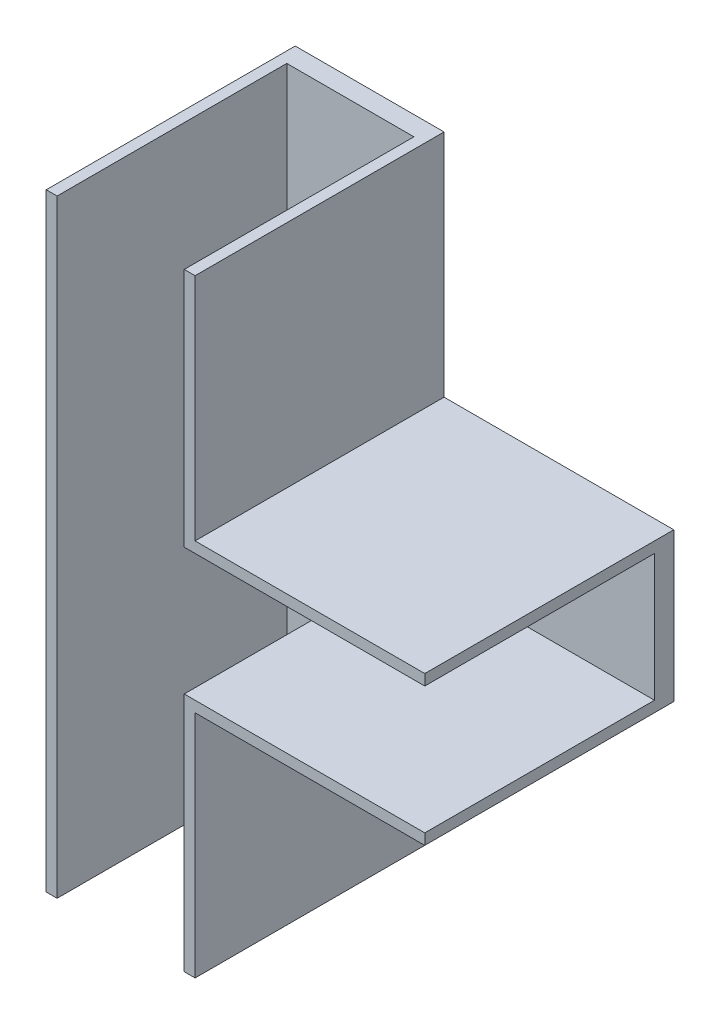
ISO-10303-21;
HEADER;
FILE_DESCRIPTION(('STEP AP214'),'2;1');
FILE_NAME('part.step','',(''),(''),'','','');
FILE_SCHEMA(('AUTOMOTIVE_DESIGN { 1 0 10303 214 1 1 1 1 }'));
ENDSEC;
DATA;
#1=APPLICATION_CONTEXT('core data for automotive mechanical design processes');
#2=APPLICATION_PROTOCOL_DEFINITION('international standard','automotive_design',2000,#1);
#3=PRODUCT_CONTEXT('',#1,'mechanical');
#4=PRODUCT('Part','Part','',(#3));
#5=PRODUCT_RELATED_PRODUCT_CATEGORY('part','',(#4));
#6=PRODUCT_DEFINITION_FORMATION('','',#4);
#7=PRODUCT_DEFINITION_CONTEXT('part definition',#1,'design');
#8=PRODUCT_DEFINITION('design','',#6,#7);
#9=PRODUCT_DEFINITION_SHAPE('','',#8);
#10=(LENGTH_UNIT() NAMED_UNIT(*) SI_UNIT(.MILLI.,.METRE.));
#11=(NAMED_UNIT(*) PLANE_ANGLE_UNIT() SI_UNIT($,.RADIAN.));
#12=(NAMED_UNIT(*) SI_UNIT($,.STERADIAN.) SOLID_ANGLE_UNIT());
#13=UNCERTAINTY_MEASURE_WITH_UNIT(LENGTH_MEASURE(1.E-05),#10,'distance_accuracy_value','');
#14=(GEOMETRIC_REPRESENTATION_CONTEXT(3) GLOBAL_UNCERTAINTY_ASSIGNED_CONTEXT((#13)) GLOBAL_UNIT_ASSIGNED_CONTEXT((#10,
#11,#12)) REPRESENTATION_CONTEXT('',''));
#15=CARTESIAN_POINT('',(0.,0.,0.));
#16=DIRECTION('',(0.,0.,1.));
#17=DIRECTION('',(1.,0.,0.));
#18=AXIS2_PLACEMENT_3D('',#15,#16,#17);
#19=CARTESIAN_POINT('',(0.,0.,0.8));
#20=DIRECTION('',(0.,0.,-1.));
#21=DIRECTION('',(-1.,0.,0.));
#22=AXIS2_PLACEMENT_3D('',#19,#20,#21);
#23=PLANE('',#22);
#24=DIRECTION('',(0.,-1.,0.));
#25=VECTOR('',#24,1.);
#26=CARTESIAN_POINT('',(5.7222,15.2472,0.8));
#27=LINE('',#26,#25);
#28=CARTESIAN_POINT('',(5.7222,25.2222,0.8));
#29=VERTEX_POINT('',#28);
#30=CARTESIAN_POINT('',(5.7222,15.2472,0.8));
#31=VERTEX_POINT('',#30);
#32=EDGE_CURVE('E173',#29,#31,#27,.T.);
#33=ORIENTED_EDGE('',*,*,#32,.F.);
#34=DIRECTION('',(-1.,0.,0.));
#35=VECTOR('',#34,1.);
#36=CARTESIAN_POINT('',(0.,25.2222,0.8));
#37=LINE('',#36,#35);
#38=CARTESIAN_POINT('',(0.45,25.2222,0.8));
#39=VERTEX_POINT('',#38);
#40=EDGE_CURVE('E246',#29,#39,#37,.T.);
#41=ORIENTED_EDGE('',*,*,#40,.T.);
#42=DIRECTION('',(0.,1.,0.));
#43=VECTOR('',#42,1.);
#44=CARTESIAN_POINT('',(0.45,25.2222,0.8));
#45=LINE('',#44,#43);
#46=CARTESIAN_POINT('',(0.450000000000002,0.,0.8));
#47=VERTEX_POINT('',#46);
#48=EDGE_CURVE('E221',#47,#39,#45,.T.);
#49=ORIENTED_EDGE('',*,*,#48,.F.);
#50=DIRECTION('',(1.,0.,0.));
#51=VECTOR('',#50,1.);
#52=CARTESIAN_POINT('',(6.1722,0.,0.8));
#53=LINE('',#52,#51);
#54=CARTESIAN_POINT('',(5.7222,0.,0.8));
#55=VERTEX_POINT('',#54);
#56=EDGE_CURVE('E242',#47,#55,#53,.T.);
#57=ORIENTED_EDGE('',*,*,#56,.T.);
#58=DIRECTION('',(0.,-1.,0.));
#59=VECTOR('',#58,1.);
#60=CARTESIAN_POINT('',(5.7222,0.,0.8));
#61=LINE('',#60,#59);
#62=CARTESIAN_POINT('',(5.7222,9.975,0.8));
#63=VERTEX_POINT('',#62);
#64=EDGE_CURVE('E196',#63,#55,#61,.T.);
#65=ORIENTED_EDGE('',*,*,#64,.F.);
#66=DIRECTION('',(-1.,0.,0.));
#67=VECTOR('',#66,1.);
#68=CARTESIAN_POINT('',(5.7222,9.975,0.8));
#69=LINE('',#68,#67);
#70=CARTESIAN_POINT('',(15.6972,9.975,0.8));
#71=VERTEX_POINT('',#70);
#72=EDGE_CURVE('E191',#71,#63,#69,.T.);
#73=ORIENTED_EDGE('',*,*,#72,.F.);
#74=DIRECTION('',(0.,1.,0.));
#75=VECTOR('',#74,1.);
#76=CARTESIAN_POINT('',(15.6972,15.6972,0.8));
#77=LINE('',#76,#75);
#78=CARTESIAN_POINT('',(15.6972,15.2472,0.8));
#79=VERTEX_POINT('',#78);
#80=EDGE_CURVE('E53',#71,#79,#77,.T.);
#81=ORIENTED_EDGE('',*,*,#80,.T.);
#82=DIRECTION('',(1.,0.,0.));
#83=VECTOR('',#82,1.);
#84=CARTESIAN_POINT('',(15.6972,15.2472,0.8));
#85=LINE('',#84,#83);
#86=EDGE_CURVE('E48',#31,#79,#85,.T.);
#87=ORIENTED_EDGE('',*,*,#86,.F.);
#88=EDGE_LOOP('',(#33,#41,#49,#57,#65,#73,#81,#87));
#89=FACE_BOUND('',#88,.T.);
#90=ADVANCED_FACE('F33',(#89),#23,.F.);
#91=CARTESIAN_POINT('',(6.1722,0.,0.8));
#92=DIRECTION('',(0.,1.,0.));
#93=DIRECTION('',(-1.,0.,0.));
#94=AXIS2_PLACEMENT_3D('',#91,#92,#93);
#95=PLANE('',#94);
#96=DIRECTION('',(1.,0.,0.));
#97=VECTOR('',#96,1.);
#98=CARTESIAN_POINT('',(6.1722,0.,0.));
#99=LINE('',#98,#97);
#100=CARTESIAN_POINT('',(0.,0.,0.));
#101=VERTEX_POINT('',#100);
#102=CARTESIAN_POINT('',(6.1722,0.,0.));
#103=VERTEX_POINT('',#102);
#104=EDGE_CURVE('E241',#101,#103,#99,.T.);
#105=ORIENTED_EDGE('',*,*,#104,.T.);
#106=DIRECTION('',(0.,0.,-1.));
#107=VECTOR('',#106,1.);
#108=CARTESIAN_POINT('',(6.1722,0.,0.8));
#109=LINE('',#108,#107);
#110=CARTESIAN_POINT('',(6.1722,0.,10.325));
#111=VERTEX_POINT('',#110);
#112=EDGE_CURVE('E11',#111,#103,#109,.T.);
#113=ORIENTED_EDGE('',*,*,#112,.F.);
#114=DIRECTION('',(1.,0.,0.));
#115=VECTOR('',#114,1.);
#116=CARTESIAN_POINT('',(5.7222,0.,10.325));
#117=LINE('',#116,#115);
#118=CARTESIAN_POINT('',(5.7222,0.,10.325));
#119=VERTEX_POINT('',#118);
#120=EDGE_CURVE('E192',#119,#111,#117,.T.);
#121=ORIENTED_EDGE('',*,*,#120,.F.);
#122=DIRECTION('',(0.,0.,-1.));
#123=VECTOR('',#122,1.);
#124=CARTESIAN_POINT('',(5.7222,0.,10.325));
#125=LINE('',#124,#123);
#126=EDGE_CURVE('E208',#119,#55,#125,.T.);
#127=ORIENTED_EDGE('',*,*,#126,.T.);
#128=ORIENTED_EDGE('',*,*,#56,.F.);
#129=DIRECTION('',(0.,0.,-1.));
#130=VECTOR('',#129,1.);
#131=CARTESIAN_POINT('',(0.450000000000003,0.,10.325));
#132=LINE('',#131,#130);
#133=CARTESIAN_POINT('',(0.450000000000003,0.,10.325));
#134=VERTEX_POINT('',#133);
#135=EDGE_CURVE('E238',#134,#47,#132,.T.);
#136=ORIENTED_EDGE('',*,*,#135,.F.);
#137=DIRECTION('',(1.,0.,0.));
#138=VECTOR('',#137,1.);
#139=CARTESIAN_POINT('',(0.,0.,10.325));
#140=LINE('',#139,#138);
#141=CARTESIAN_POINT('',(0.,0.,10.325));
#142=VERTEX_POINT('',#141);
#143=EDGE_CURVE('E222',#142,#134,#140,.T.);
#144=ORIENTED_EDGE('',*,*,#143,.F.);
#145=DIRECTION('',(0.,0.,-1.));
#146=VECTOR('',#145,1.);
#147=CARTESIAN_POINT('',(0.,0.,0.8));
#148=LINE('',#147,#146);
#149=EDGE_CURVE('E248',#142,#101,#148,.T.);
#150=ORIENTED_EDGE('',*,*,#149,.T.);
#151=EDGE_LOOP('',(#105,#113,#121,#127,#128,#136,#144,#150));
#152=FACE_BOUND('',#151,.T.);
#153=ADVANCED_FACE('F35',(#152),#95,.F.);
#154=CARTESIAN_POINT('',(6.1722,9.525,0.8));
#155=DIRECTION('',(-1.,0.,0.));
#156=DIRECTION('',(0.,-1.,0.));
#157=AXIS2_PLACEMENT_3D('',#154,#155,#156);
#158=PLANE('',#157);
#159=DIRECTION('',(0.,1.,0.));
#160=VECTOR('',#159,1.);
#161=CARTESIAN_POINT('',(6.1722,9.525,0.));
#162=LINE('',#161,#160);
#163=CARTESIAN_POINT('',(6.1722,9.525,0.));
#164=VERTEX_POINT('',#163);
#165=EDGE_CURVE('E251',#103,#164,#162,.T.);
#166=ORIENTED_EDGE('',*,*,#165,.T.);
#167=DIRECTION('',(0.,0.,-1.));
#168=VECTOR('',#167,1.);
#169=CARTESIAN_POINT('',(6.1722,9.525,0.8));
#170=LINE('',#169,#168);
#171=CARTESIAN_POINT('',(6.1722,9.525,10.325));
#172=VERTEX_POINT('',#171);
#173=EDGE_CURVE('E41',#172,#164,#170,.T.);
#174=ORIENTED_EDGE('',*,*,#173,.F.);
#175=DIRECTION('',(0.,1.,0.));
#176=VECTOR('',#175,1.);
#177=CARTESIAN_POINT('',(6.1722,0.,10.325));
#178=LINE('',#177,#176);
#179=EDGE_CURVE('E195',#111,#172,#178,.T.);
#180=ORIENTED_EDGE('',*,*,#179,.F.);
#181=ORIENTED_EDGE('',*,*,#112,.T.);
#182=EDGE_LOOP('',(#166,#174,#180,#181));
#183=FACE_BOUND('',#182,.T.);
#184=ADVANCED_FACE('F307',(#183),#158,.F.);
#185=CARTESIAN_POINT('',(15.6972,9.525,0.8));
#186=DIRECTION('',(0.,1.,0.));
#187=DIRECTION('',(-1.,0.,0.));
#188=AXIS2_PLACEMENT_3D('',#185,#186,#187);
#189=PLANE('',#188);
#190=DIRECTION('',(1.,0.,0.));
#191=VECTOR('',#190,1.);
#192=CARTESIAN_POINT('',(15.6972,9.525,0.));
#193=LINE('',#192,#191);
#194=CARTESIAN_POINT('',(15.6972,9.525,0.));
#195=VERTEX_POINT('',#194);
#196=EDGE_CURVE('E253',#164,#195,#193,.T.);
#197=ORIENTED_EDGE('',*,*,#196,.T.);
#198=DIRECTION('',(0.,0.,-1.));
#199=VECTOR('',#198,1.);
#200=CARTESIAN_POINT('',(15.6972,9.525,0.8));
#201=LINE('',#200,#199);
#202=CARTESIAN_POINT('',(15.6972,9.525,10.325));
#203=VERTEX_POINT('',#202);
#204=EDGE_CURVE('E156',#203,#195,#201,.T.);
#205=ORIENTED_EDGE('',*,*,#204,.F.);
#206=DIRECTION('',(1.,0.,0.));
#207=VECTOR('',#206,1.);
#208=CARTESIAN_POINT('',(6.1722,9.525,10.325));
#209=LINE('',#208,#207);
#210=EDGE_CURVE('E199',#172,#203,#209,.T.);
#211=ORIENTED_EDGE('',*,*,#210,.F.);
#212=ORIENTED_EDGE('',*,*,#173,.T.);
#213=EDGE_LOOP('',(#197,#205,#211,#212));
#214=FACE_BOUND('',#213,.T.);
#215=ADVANCED_FACE('F276',(#214),#189,.F.);
#216=CARTESIAN_POINT('',(15.6972,15.6972,0.8));
#217=DIRECTION('',(-1.,0.,0.));
#218=DIRECTION('',(0.,0.,1.));
#219=AXIS2_PLACEMENT_3D('',#216,#217,#218);
#220=PLANE('',#219);
#221=DIRECTION('',(0.,1.,0.));
#222=VECTOR('',#221,1.);
#223=CARTESIAN_POINT('',(15.6972,15.6972,0.));
#224=LINE('',#223,#222);
#225=CARTESIAN_POINT('',(15.6972,15.6972,0.));
#226=VERTEX_POINT('',#225);
#227=EDGE_CURVE('E153',#195,#226,#224,.T.);
#228=ORIENTED_EDGE('',*,*,#227,.T.);
#229=DIRECTION('',(0.,0.,-1.));
#230=VECTOR('',#229,1.);
#231=CARTESIAN_POINT('',(15.6972,15.6972,0.8));
#232=LINE('',#231,#230);
#233=CARTESIAN_POINT('',(15.6972,15.6972,10.325));
#234=VERTEX_POINT('',#233);
#235=EDGE_CURVE('E145',#234,#226,#232,.T.);
#236=ORIENTED_EDGE('',*,*,#235,.F.);
#237=DIRECTION('',(0.,1.,0.));
#238=VECTOR('',#237,1.);
#239=CARTESIAN_POINT('',(15.6972,15.6972,10.325));
#240=LINE('',#239,#238);
#241=CARTESIAN_POINT('',(15.6972,15.2472,10.325));
#242=VERTEX_POINT('',#241);
#243=EDGE_CURVE('E150',#242,#234,#240,.T.);
#244=ORIENTED_EDGE('',*,*,#243,.F.);
#245=DIRECTION('',(0.,0.,-1.));
#246=VECTOR('',#245,1.);
#247=CARTESIAN_POINT('',(15.6972,15.2472,10.325));
#248=LINE('',#247,#246);
#249=EDGE_CURVE('E182',#242,#79,#248,.T.);
#250=ORIENTED_EDGE('',*,*,#249,.T.);
#251=ORIENTED_EDGE('',*,*,#80,.F.);
#252=DIRECTION('',(0.,0.,-1.));
#253=VECTOR('',#252,1.);
#254=CARTESIAN_POINT('',(15.6972,9.975,10.325));
#255=LINE('',#254,#253);
#256=CARTESIAN_POINT('',(15.6972,9.975,10.325));
#257=VERTEX_POINT('',#256);
#258=EDGE_CURVE('E218',#257,#71,#255,.T.);
#259=ORIENTED_EDGE('',*,*,#258,.F.);
#260=DIRECTION('',(0.,1.,0.));
#261=VECTOR('',#260,1.);
#262=CARTESIAN_POINT('',(15.6972,9.975,10.325));
#263=LINE('',#262,#261);
#264=EDGE_CURVE('E202',#203,#257,#263,.T.);
#265=ORIENTED_EDGE('',*,*,#264,.F.);
#266=ORIENTED_EDGE('',*,*,#204,.T.);
#267=EDGE_LOOP('',(#228,#236,#244,#250,#251,#259,#265,#266));
#268=FACE_BOUND('',#267,.T.);
#269=ADVANCED_FACE('F147',(#268),#220,.F.);
#270=CARTESIAN_POINT('',(6.1722,15.6972,0.8));
#271=DIRECTION('',(0.,-1.,0.));
#272=DIRECTION('',(0.,0.,-1.));
#273=AXIS2_PLACEMENT_3D('',#270,#271,#272);
#274=PLANE('',#273);
#275=DIRECTION('',(-1.,0.,0.));
#276=VECTOR('',#275,1.);
#277=CARTESIAN_POINT('',(6.1722,15.6972,0.));
#278=LINE('',#277,#276);
#279=CARTESIAN_POINT('',(6.1722,15.6972,0.));
#280=VERTEX_POINT('',#279);
#281=EDGE_CURVE('E256',#226,#280,#278,.T.);
#282=ORIENTED_EDGE('',*,*,#281,.T.);
#283=DIRECTION('',(0.,0.,-1.));
#284=VECTOR('',#283,1.);
#285=CARTESIAN_POINT('',(6.1722,15.6972,0.8));
#286=LINE('',#285,#284);
#287=CARTESIAN_POINT('',(6.1722,15.6972,10.325));
#288=VERTEX_POINT('',#287);
#289=EDGE_CURVE('E157',#288,#280,#286,.T.);
#290=ORIENTED_EDGE('',*,*,#289,.F.);
#291=DIRECTION('',(-1.,0.,0.));
#292=VECTOR('',#291,1.);
#293=CARTESIAN_POINT('',(15.6972,15.6972,10.325));
#294=LINE('',#293,#292);
#295=EDGE_CURVE('E160',#234,#288,#294,.T.);
#296=ORIENTED_EDGE('',*,*,#295,.F.);
#297=ORIENTED_EDGE('',*,*,#235,.T.);
#298=EDGE_LOOP('',(#282,#290,#296,#297));
#299=FACE_BOUND('',#298,.T.);
#300=ADVANCED_FACE('F161',(#299),#274,.F.);
#301=CARTESIAN_POINT('',(6.1722,25.2222,0.8));
#302=DIRECTION('',(-1.,0.,0.));
#303=DIRECTION('',(0.,0.,1.));
#304=AXIS2_PLACEMENT_3D('',#301,#302,#303);
#305=PLANE('',#304);
#306=DIRECTION('',(0.,1.,0.));
#307=VECTOR('',#306,1.);
#308=CARTESIAN_POINT('',(6.1722,25.2222,0.));
#309=LINE('',#308,#307);
#310=CARTESIAN_POINT('',(6.1722,25.2222,0.));
#311=VERTEX_POINT('',#310);
#312=EDGE_CURVE('E258',#280,#311,#309,.T.);
#313=ORIENTED_EDGE('',*,*,#312,.T.);
#314=DIRECTION('',(0.,0.,-1.));
#315=VECTOR('',#314,1.);
#316=CARTESIAN_POINT('',(6.1722,25.2222,0.8));
#317=LINE('',#316,#315);
#318=CARTESIAN_POINT('',(6.1722,25.2222,10.325));
#319=VERTEX_POINT('',#318);
#320=EDGE_CURVE('E268',#319,#311,#317,.T.);
#321=ORIENTED_EDGE('',*,*,#320,.F.);
#322=DIRECTION('',(0.,1.,0.));
#323=VECTOR('',#322,1.);
#324=CARTESIAN_POINT('',(6.1722,15.6972,10.325));
#325=LINE('',#324,#323);
#326=EDGE_CURVE('E166',#288,#319,#325,.T.);
#327=ORIENTED_EDGE('',*,*,#326,.F.);
#328=ORIENTED_EDGE('',*,*,#289,.T.);
#329=EDGE_LOOP('',(#313,#321,#327,#328));
#330=FACE_BOUND('',#329,.T.);
#331=ADVANCED_FACE('F285',(#330),#305,.F.);
#332=CARTESIAN_POINT('',(0.,25.2222,0.8));
#333=DIRECTION('',(0.,-1.,0.));
#334=DIRECTION('',(0.,0.,-1.));
#335=AXIS2_PLACEMENT_3D('',#332,#333,#334);
#336=PLANE('',#335);
#337=DIRECTION('',(-1.,0.,0.));
#338=VECTOR('',#337,1.);
#339=CARTESIAN_POINT('',(0.,25.2222,0.));
#340=LINE('',#339,#338);
#341=CARTESIAN_POINT('',(0.,25.2222,0.));
#342=VERTEX_POINT('',#341);
#343=EDGE_CURVE('E260',#311,#342,#340,.T.);
#344=ORIENTED_EDGE('',*,*,#343,.T.);
#345=DIRECTION('',(0.,0.,-1.));
#346=VECTOR('',#345,1.);
#347=CARTESIAN_POINT('',(0.,25.2222,0.8));
#348=LINE('',#347,#346);
#349=CARTESIAN_POINT('',(0.,25.2222,10.325));
#350=VERTEX_POINT('',#349);
#351=EDGE_CURVE('E265',#350,#342,#348,.T.);
#352=ORIENTED_EDGE('',*,*,#351,.F.);
#353=DIRECTION('',(-1.,0.,0.));
#354=VECTOR('',#353,1.);
#355=CARTESIAN_POINT('',(0.,25.2222,10.325));
#356=LINE('',#355,#354);
#357=CARTESIAN_POINT('',(0.45,25.2222,10.325));
#358=VERTEX_POINT('',#357);
#359=EDGE_CURVE('E227',#358,#350,#356,.T.);
#360=ORIENTED_EDGE('',*,*,#359,.F.);
#361=DIRECTION('',(0.,0.,-1.));
#362=VECTOR('',#361,1.);
#363=CARTESIAN_POINT('',(0.45,25.2222,10.325));
#364=LINE('',#363,#362);
#365=EDGE_CURVE('E233',#358,#39,#364,.T.);
#366=ORIENTED_EDGE('',*,*,#365,.T.);
#367=ORIENTED_EDGE('',*,*,#40,.F.);
#368=DIRECTION('',(0.,0.,-1.));
#369=VECTOR('',#368,1.);
#370=CARTESIAN_POINT('',(5.7222,25.2222,10.325));
#371=LINE('',#370,#369);
#372=CARTESIAN_POINT('',(5.7222,25.2222,10.325));
#373=VERTEX_POINT('',#372);
#374=EDGE_CURVE('E188',#373,#29,#371,.T.);
#375=ORIENTED_EDGE('',*,*,#374,.F.);
#376=DIRECTION('',(-1.,0.,0.));
#377=VECTOR('',#376,1.);
#378=CARTESIAN_POINT('',(6.1722,25.2222,10.325));
#379=LINE('',#378,#377);
#380=EDGE_CURVE('E177',#319,#373,#379,.T.);
#381=ORIENTED_EDGE('',*,*,#380,.F.);
#382=ORIENTED_EDGE('',*,*,#320,.T.);
#383=EDGE_LOOP('',(#344,#352,#360,#366,#367,#375,#381,#382));
#384=FACE_BOUND('',#383,.T.);
#385=ADVANCED_FACE('F289',(#384),#336,.F.);
#386=CARTESIAN_POINT('',(0.,0.,0.8));
#387=DIRECTION('',(1.,0.,0.));
#388=DIRECTION('',(0.,0.,-1.));
#389=AXIS2_PLACEMENT_3D('',#386,#387,#388);
#390=PLANE('',#389);
#391=DIRECTION('',(0.,-1.,0.));
#392=VECTOR('',#391,1.);
#393=CARTESIAN_POINT('',(0.,0.,0.));
#394=LINE('',#393,#392);
#395=EDGE_CURVE('E244',#342,#101,#394,.T.);
#396=ORIENTED_EDGE('',*,*,#395,.T.);
#397=ORIENTED_EDGE('',*,*,#149,.F.);
#398=DIRECTION('',(0.,-1.,0.));
#399=VECTOR('',#398,1.);
#400=CARTESIAN_POINT('',(0.,25.2222,10.325));
#401=LINE('',#400,#399);
#402=EDGE_CURVE('E230',#350,#142,#401,.T.);
#403=ORIENTED_EDGE('',*,*,#402,.F.);
#404=ORIENTED_EDGE('',*,*,#351,.T.);
#405=EDGE_LOOP('',(#396,#397,#403,#404));
#406=FACE_BOUND('',#405,.T.);
#407=ADVANCED_FACE('F312',(#406),#390,.F.);
#408=CARTESIAN_POINT('',(0.,0.,0.));
#409=DIRECTION('',(0.,0.,-1.));
#410=DIRECTION('',(-1.,0.,0.));
#411=AXIS2_PLACEMENT_3D('',#408,#409,#410);
#412=PLANE('',#411);
#413=ORIENTED_EDGE('',*,*,#104,.F.);
#414=ORIENTED_EDGE('',*,*,#395,.F.);
#415=ORIENTED_EDGE('',*,*,#343,.F.);
#416=ORIENTED_EDGE('',*,*,#312,.F.);
#417=ORIENTED_EDGE('',*,*,#281,.F.);
#418=ORIENTED_EDGE('',*,*,#227,.F.);
#419=ORIENTED_EDGE('',*,*,#196,.F.);
#420=ORIENTED_EDGE('',*,*,#165,.F.);
#421=EDGE_LOOP('',(#413,#414,#415,#416,#417,#418,#419,#420));
#422=FACE_BOUND('',#421,.T.);
#423=ADVANCED_FACE('F281',(#422),#412,.T.);
#424=CARTESIAN_POINT('',(0.45,25.2222,10.325));
#425=DIRECTION('',(-1.,0.,0.));
#426=DIRECTION('',(0.,-1.,0.));
#427=AXIS2_PLACEMENT_3D('',#424,#425,#426);
#428=PLANE('',#427);
#429=ORIENTED_EDGE('',*,*,#48,.T.);
#430=ORIENTED_EDGE('',*,*,#365,.F.);
#431=DIRECTION('',(0.,1.,0.));
#432=VECTOR('',#431,1.);
#433=CARTESIAN_POINT('',(0.45,25.2222,10.325));
#434=LINE('',#433,#432);
#435=EDGE_CURVE('E225',#134,#358,#434,.T.);
#436=ORIENTED_EDGE('',*,*,#435,.F.);
#437=ORIENTED_EDGE('',*,*,#135,.T.);
#438=EDGE_LOOP('',(#429,#430,#436,#437));
#439=FACE_BOUND('',#438,.T.);
#440=ADVANCED_FACE('F320',(#439),#428,.F.);
#441=CARTESIAN_POINT('',(0.,0.,10.325));
#442=DIRECTION('',(0.,0.,-1.));
#443=DIRECTION('',(-1.,0.,0.));
#444=AXIS2_PLACEMENT_3D('',#441,#442,#443);
#445=PLANE('',#444);
#446=ORIENTED_EDGE('',*,*,#143,.T.);
#447=ORIENTED_EDGE('',*,*,#435,.T.);
#448=ORIENTED_EDGE('',*,*,#359,.T.);
#449=ORIENTED_EDGE('',*,*,#402,.T.);
#450=EDGE_LOOP('',(#446,#447,#448,#449));
#451=FACE_BOUND('',#450,.T.);
#452=ADVANCED_FACE('F316',(#451),#445,.F.);
#453=CARTESIAN_POINT('',(5.7222,9.975,10.325));
#454=DIRECTION('',(0.,-1.,0.));
#455=DIRECTION('',(0.,0.,-1.));
#456=AXIS2_PLACEMENT_3D('',#453,#454,#455);
#457=PLANE('',#456);
#458=ORIENTED_EDGE('',*,*,#72,.T.);
#459=DIRECTION('',(0.,0.,-1.));
#460=VECTOR('',#459,1.);
#461=CARTESIAN_POINT('',(5.7222,9.975,10.325));
#462=LINE('',#461,#460);
#463=CARTESIAN_POINT('',(5.7222,9.975,10.325));
#464=VERTEX_POINT('',#463);
#465=EDGE_CURVE('E215',#464,#63,#462,.T.);
#466=ORIENTED_EDGE('',*,*,#465,.F.);
#467=DIRECTION('',(-1.,0.,0.));
#468=VECTOR('',#467,1.);
#469=CARTESIAN_POINT('',(5.7222,9.975,10.325));
#470=LINE('',#469,#468);
#471=EDGE_CURVE('E204',#257,#464,#470,.T.);
#472=ORIENTED_EDGE('',*,*,#471,.F.);
#473=ORIENTED_EDGE('',*,*,#258,.T.);
#474=EDGE_LOOP('',(#458,#466,#472,#473));
#475=FACE_BOUND('',#474,.T.);
#476=ADVANCED_FACE('F301',(#475),#457,.F.);
#477=CARTESIAN_POINT('',(5.7222,0.,10.325));
#478=DIRECTION('',(1.,0.,0.));
#479=DIRECTION('',(0.,0.,-1.));
#480=AXIS2_PLACEMENT_3D('',#477,#478,#479);
#481=PLANE('',#480);
#482=ORIENTED_EDGE('',*,*,#64,.T.);
#483=ORIENTED_EDGE('',*,*,#126,.F.);
#484=DIRECTION('',(0.,-1.,0.));
#485=VECTOR('',#484,1.);
#486=CARTESIAN_POINT('',(5.7222,0.,10.325));
#487=LINE('',#486,#485);
#488=EDGE_CURVE('E206',#464,#119,#487,.T.);
#489=ORIENTED_EDGE('',*,*,#488,.F.);
#490=ORIENTED_EDGE('',*,*,#465,.T.);
#491=EDGE_LOOP('',(#482,#483,#489,#490));
#492=FACE_BOUND('',#491,.T.);
#493=ADVANCED_FACE('F323',(#492),#481,.F.);
#494=CARTESIAN_POINT('',(0.,0.,10.325));
#495=DIRECTION('',(0.,0.,1.));
#496=DIRECTION('',(1.,0.,0.));
#497=AXIS2_PLACEMENT_3D('',#494,#495,#496);
#498=PLANE('',#497);
#499=ORIENTED_EDGE('',*,*,#120,.T.);
#500=ORIENTED_EDGE('',*,*,#179,.T.);
#501=ORIENTED_EDGE('',*,*,#210,.T.);
#502=ORIENTED_EDGE('',*,*,#264,.T.);
#503=ORIENTED_EDGE('',*,*,#471,.T.);
#504=ORIENTED_EDGE('',*,*,#488,.T.);
#505=EDGE_LOOP('',(#499,#500,#501,#502,#503,#504));
#506=FACE_BOUND('',#505,.T.);
#507=ADVANCED_FACE('F304',(#506),#498,.T.);
#508=CARTESIAN_POINT('',(5.7222,15.2472,10.325));
#509=DIRECTION('',(1.,0.,0.));
#510=DIRECTION('',(0.,0.,-1.));
#511=AXIS2_PLACEMENT_3D('',#508,#509,#510);
#512=PLANE('',#511);
#513=ORIENTED_EDGE('',*,*,#32,.T.);
#514=DIRECTION('',(0.,0.,-1.));
#515=VECTOR('',#514,1.);
#516=CARTESIAN_POINT('',(5.7222,15.2472,10.325));
#517=LINE('',#516,#515);
#518=CARTESIAN_POINT('',(5.7222,15.2472,10.325));
#519=VERTEX_POINT('',#518);
#520=EDGE_CURVE('E185',#519,#31,#517,.T.);
#521=ORIENTED_EDGE('',*,*,#520,.F.);
#522=DIRECTION('',(0.,-1.,0.));
#523=VECTOR('',#522,1.);
#524=CARTESIAN_POINT('',(5.7222,15.2472,10.325));
#525=LINE('',#524,#523);
#526=EDGE_CURVE('E179',#373,#519,#525,.T.);
#527=ORIENTED_EDGE('',*,*,#526,.F.);
#528=ORIENTED_EDGE('',*,*,#374,.T.);
#529=EDGE_LOOP('',(#513,#521,#527,#528));
#530=FACE_BOUND('',#529,.T.);
#531=ADVANCED_FACE('F293',(#530),#512,.F.);
#532=CARTESIAN_POINT('',(15.6972,15.2472,10.325));
#533=DIRECTION('',(0.,1.,0.));
#534=DIRECTION('',(0.,0.,1.));
#535=AXIS2_PLACEMENT_3D('',#532,#533,#534);
#536=PLANE('',#535);
#537=ORIENTED_EDGE('',*,*,#86,.T.);
#538=ORIENTED_EDGE('',*,*,#249,.F.);
#539=DIRECTION('',(1.,0.,0.));
#540=VECTOR('',#539,1.);
#541=CARTESIAN_POINT('',(15.6972,15.2472,10.325));
#542=LINE('',#541,#540);
#543=EDGE_CURVE('E170',#519,#242,#542,.T.);
#544=ORIENTED_EDGE('',*,*,#543,.F.);
#545=ORIENTED_EDGE('',*,*,#520,.T.);
#546=EDGE_LOOP('',(#537,#538,#544,#545));
#547=FACE_BOUND('',#546,.T.);
#548=ADVANCED_FACE('F295',(#547),#536,.F.);
#549=CARTESIAN_POINT('',(0.,0.,10.325));
#550=DIRECTION('',(0.,0.,-1.));
#551=DIRECTION('',(-1.,0.,0.));
#552=AXIS2_PLACEMENT_3D('',#549,#550,#551);
#553=PLANE('',#552);
#554=ORIENTED_EDGE('',*,*,#243,.T.);
#555=ORIENTED_EDGE('',*,*,#295,.T.);
#556=ORIENTED_EDGE('',*,*,#326,.T.);
#557=ORIENTED_EDGE('',*,*,#380,.T.);
#558=ORIENTED_EDGE('',*,*,#526,.T.);
#559=ORIENTED_EDGE('',*,*,#543,.T.);
#560=EDGE_LOOP('',(#554,#555,#556,#557,#558,#559));
#561=FACE_BOUND('',#560,.T.);
#562=ADVANCED_FACE('F168',(#561),#553,.F.);
#563=CLOSED_SHELL('',(#90,#153,#184,#215,#269,#300,#331,#385,#407,#423,#440,#452,#476,#493,#507,
#531,#548,#562));
#564=MANIFOLD_SOLID_BREP('B2',#563);
#565=ADVANCED_BREP_SHAPE_REPRESENTATION('',(#18,#564),#14);
#566=SHAPE_DEFINITION_REPRESENTATION(#9,#565);
ENDSEC;
END-ISO-10303-21;
